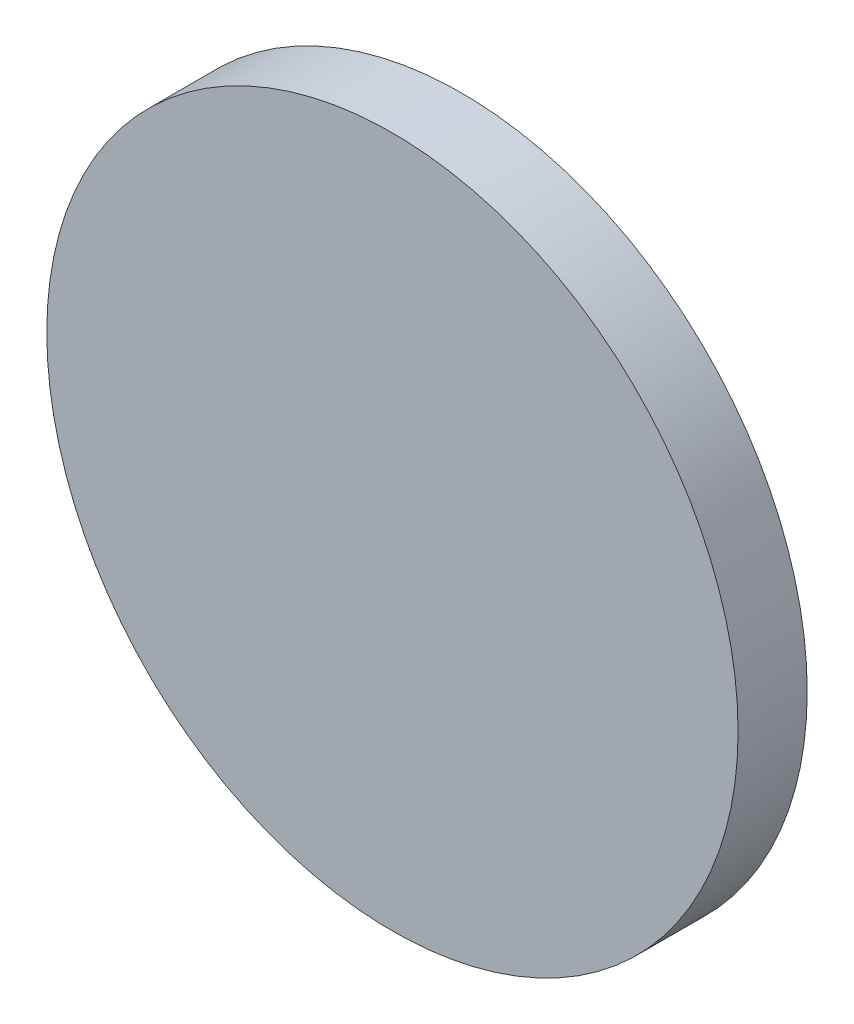
ISO-10303-21;
HEADER;
FILE_DESCRIPTION(('STEP AP214'),'2;1');
FILE_NAME('part.step','',(''),(''),'','','');
FILE_SCHEMA(('AUTOMOTIVE_DESIGN { 1 0 10303 214 1 1 1 1 }'));
ENDSEC;
DATA;
#1=APPLICATION_CONTEXT('core data for automotive mechanical design processes');
#2=APPLICATION_PROTOCOL_DEFINITION('international standard','automotive_design',2000,#1);
#3=PRODUCT_CONTEXT('',#1,'mechanical');
#4=PRODUCT('Part','Part','',(#3));
#5=PRODUCT_RELATED_PRODUCT_CATEGORY('part','',(#4));
#6=PRODUCT_DEFINITION_FORMATION('','',#4);
#7=PRODUCT_DEFINITION_CONTEXT('part definition',#1,'design');
#8=PRODUCT_DEFINITION('design','',#6,#7);
#9=PRODUCT_DEFINITION_SHAPE('','',#8);
#10=(LENGTH_UNIT() NAMED_UNIT(*) SI_UNIT(.MILLI.,.METRE.));
#11=(NAMED_UNIT(*) PLANE_ANGLE_UNIT() SI_UNIT($,.RADIAN.));
#12=(NAMED_UNIT(*) SI_UNIT($,.STERADIAN.) SOLID_ANGLE_UNIT());
#13=UNCERTAINTY_MEASURE_WITH_UNIT(LENGTH_MEASURE(1.E-05),#10,'distance_accuracy_value','');
#14=(GEOMETRIC_REPRESENTATION_CONTEXT(3) GLOBAL_UNCERTAINTY_ASSIGNED_CONTEXT((#13)) GLOBAL_UNIT_ASSIGNED_CONTEXT((#10,
#11,#12)) REPRESENTATION_CONTEXT('',''));
#15=CARTESIAN_POINT('',(0.,0.,0.));
#16=DIRECTION('',(0.,0.,1.));
#17=DIRECTION('',(1.,0.,0.));
#18=AXIS2_PLACEMENT_3D('',#15,#16,#17);
#19=CARTESIAN_POINT('',(0.,0.,10.));
#20=DIRECTION('',(0.,0.,-1.));
#21=DIRECTION('',(-1.,0.,0.));
#22=AXIS2_PLACEMENT_3D('',#19,#20,#21);
#23=CYLINDRICAL_SURFACE('',#22,50.);
#24=CARTESIAN_POINT('',(0.,0.,10.));
#25=DIRECTION('',(0.,0.,1.));
#26=DIRECTION('',(1.,0.,0.));
#27=AXIS2_PLACEMENT_3D('',#24,#25,#26);
#28=CIRCLE('',#27,50.);
#29=CARTESIAN_POINT('',(50.,0.,10.));
#30=VERTEX_POINT('',#29);
#31=EDGE_CURVE('E10',#30,#30,#28,.T.);
#32=ORIENTED_EDGE('',*,*,#31,.F.);
#33=EDGE_LOOP('',(#32));
#34=FACE_BOUND('',#33,.T.);
#35=CARTESIAN_POINT('',(0.,0.,0.));
#36=DIRECTION('',(0.,0.,1.));
#37=DIRECTION('',(1.,0.,0.));
#38=AXIS2_PLACEMENT_3D('',#35,#36,#37);
#39=CIRCLE('',#38,50.);
#40=CARTESIAN_POINT('',(50.,0.,0.));
#41=VERTEX_POINT('',#40);
#42=EDGE_CURVE('E45',#41,#41,#39,.T.);
#43=ORIENTED_EDGE('',*,*,#42,.T.);
#44=EDGE_LOOP('',(#43));
#45=FACE_BOUND('',#44,.T.);
#46=ADVANCED_FACE('F39',(#34,#45),#23,.T.);
#47=CARTESIAN_POINT('',(0.,0.,10.));
#48=DIRECTION('',(0.,0.,1.));
#49=DIRECTION('',(1.,0.,0.));
#50=AXIS2_PLACEMENT_3D('',#47,#48,#49);
#51=PLANE('',#50);
#52=ORIENTED_EDGE('',*,*,#31,.T.);
#53=EDGE_LOOP('',(#52));
#54=FACE_BOUND('',#53,.T.);
#55=ADVANCED_FACE('F53',(#54),#51,.T.);
#56=CARTESIAN_POINT('',(0.,0.,0.));
#57=DIRECTION('',(0.,0.,1.));
#58=DIRECTION('',(1.,0.,0.));
#59=AXIS2_PLACEMENT_3D('',#56,#57,#58);
#60=PLANE('',#59);
#61=ORIENTED_EDGE('',*,*,#42,.F.);
#62=EDGE_LOOP('',(#61));
#63=FACE_BOUND('',#62,.T.);
#64=ADVANCED_FACE('F55',(#63),#60,.F.);
#65=CLOSED_SHELL('',(#46,#55,#64));
#66=MANIFOLD_SOLID_BREP('B2',#65);
#67=ADVANCED_BREP_SHAPE_REPRESENTATION('',(#18,#66),#14);
#68=SHAPE_DEFINITION_REPRESENTATION(#9,#67);
ENDSEC;
END-ISO-10303-21;
